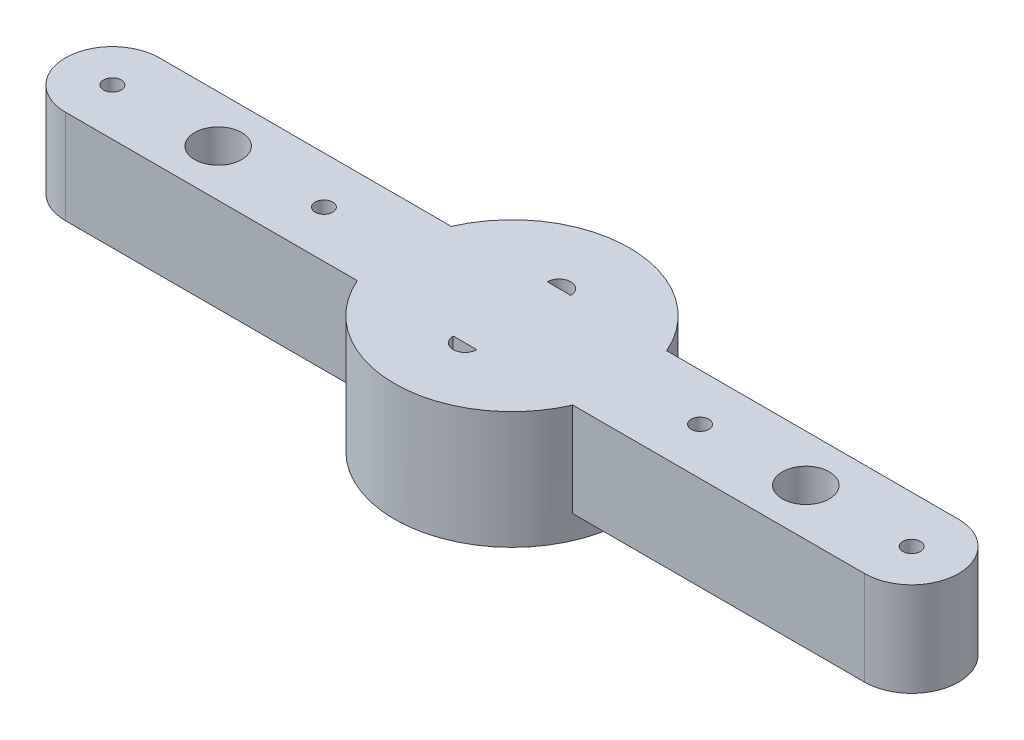
ISO-10303-21;
HEADER;
FILE_DESCRIPTION(('STEP AP214'),'2;1');
FILE_NAME('part.step','',(''),(''),'','','');
FILE_SCHEMA(('AUTOMOTIVE_DESIGN { 1 0 10303 214 1 1 1 1 }'));
ENDSEC;
DATA;
#1=APPLICATION_CONTEXT('core data for automotive mechanical design processes');
#2=APPLICATION_PROTOCOL_DEFINITION('international standard','automotive_design',2000,#1);
#3=PRODUCT_CONTEXT('',#1,'mechanical');
#4=PRODUCT('Part','Part','',(#3));
#5=PRODUCT_RELATED_PRODUCT_CATEGORY('part','',(#4));
#6=PRODUCT_DEFINITION_FORMATION('','',#4);
#7=PRODUCT_DEFINITION_CONTEXT('part definition',#1,'design');
#8=PRODUCT_DEFINITION('design','',#6,#7);
#9=PRODUCT_DEFINITION_SHAPE('','',#8);
#10=(LENGTH_UNIT() NAMED_UNIT(*) SI_UNIT(.MILLI.,.METRE.));
#11=(NAMED_UNIT(*) PLANE_ANGLE_UNIT() SI_UNIT($,.RADIAN.));
#12=(NAMED_UNIT(*) SI_UNIT($,.STERADIAN.) SOLID_ANGLE_UNIT());
#13=UNCERTAINTY_MEASURE_WITH_UNIT(LENGTH_MEASURE(1.E-05),#10,'distance_accuracy_value','');
#14=(GEOMETRIC_REPRESENTATION_CONTEXT(3) GLOBAL_UNCERTAINTY_ASSIGNED_CONTEXT((#13)) GLOBAL_UNIT_ASSIGNED_CONTEXT((#10,
#11,#12)) REPRESENTATION_CONTEXT('',''));
#15=CARTESIAN_POINT('',(0.,0.,0.));
#16=DIRECTION('',(0.,0.,1.));
#17=DIRECTION('',(1.,0.,0.));
#18=AXIS2_PLACEMENT_3D('',#15,#16,#17);
#19=CARTESIAN_POINT('',(34.,0.,0.));
#20=DIRECTION('',(0.,-1.,0.));
#21=DIRECTION('',(0.,0.,-1.));
#22=AXIS2_PLACEMENT_3D('',#19,#20,#21);
#23=PLANE('',#22);
#24=CARTESIAN_POINT('',(0.,0.,0.));
#25=DIRECTION('',(0.,-1.,0.));
#26=DIRECTION('',(0.,0.,-1.));
#27=AXIS2_PLACEMENT_3D('',#24,#25,#26);
#28=CIRCLE('',#27,10.);
#29=CARTESIAN_POINT('',(9.16515138991168,0.,-4.));
#30=VERTEX_POINT('',#29);
#31=CARTESIAN_POINT('',(9.16515138991168,0.,4.));
#32=VERTEX_POINT('',#31);
#33=EDGE_CURVE('E181',#30,#32,#28,.T.);
#34=ORIENTED_EDGE('',*,*,#33,.F.);
#35=DIRECTION('',(-1.,0.,0.));
#36=VECTOR('',#35,1.);
#37=CARTESIAN_POINT('',(-34.,0.,-4.));
#38=LINE('',#37,#36);
#39=CARTESIAN_POINT('',(34.,0.,-4.));
#40=VERTEX_POINT('',#39);
#41=EDGE_CURVE('E131',#40,#30,#38,.T.);
#42=ORIENTED_EDGE('',*,*,#41,.F.);
#43=CARTESIAN_POINT('',(34.,0.,0.));
#44=DIRECTION('',(0.,1.,0.));
#45=DIRECTION('',(0.,0.,-1.));
#46=AXIS2_PLACEMENT_3D('',#43,#44,#45);
#47=CIRCLE('',#46,4.);
#48=CARTESIAN_POINT('',(34.,0.,4.));
#49=VERTEX_POINT('',#48);
#50=EDGE_CURVE('E240',#49,#40,#47,.T.);
#51=ORIENTED_EDGE('',*,*,#50,.F.);
#52=DIRECTION('',(1.,0.,0.));
#53=VECTOR('',#52,1.);
#54=CARTESIAN_POINT('',(34.,0.,4.));
#55=LINE('',#54,#53);
#56=EDGE_CURVE('E220',#32,#49,#55,.T.);
#57=ORIENTED_EDGE('',*,*,#56,.F.);
#58=EDGE_LOOP('',(#34,#42,#51,#57));
#59=FACE_BOUND('',#58,.T.);
#60=CARTESIAN_POINT('',(16.,0.,0.));
#61=DIRECTION('',(0.,1.,0.));
#62=DIRECTION('',(0.,0.,1.));
#63=AXIS2_PLACEMENT_3D('',#60,#61,#62);
#64=CIRCLE('',#63,0.750000000000002);
#65=CARTESIAN_POINT('',(16.,0.,0.750000000000002));
#66=VERTEX_POINT('',#65);
#67=EDGE_CURVE('E186',#66,#66,#64,.T.);
#68=ORIENTED_EDGE('',*,*,#67,.T.);
#69=EDGE_LOOP('',(#68));
#70=FACE_BOUND('',#69,.T.);
#71=CARTESIAN_POINT('',(25.,0.,0.));
#72=DIRECTION('',(0.,1.,0.));
#73=DIRECTION('',(0.,0.,1.));
#74=AXIS2_PLACEMENT_3D('',#71,#72,#73);
#75=CIRCLE('',#74,2.);
#76=CARTESIAN_POINT('',(25.,0.,2.));
#77=VERTEX_POINT('',#76);
#78=EDGE_CURVE('E208',#77,#77,#75,.T.);
#79=ORIENTED_EDGE('',*,*,#78,.T.);
#80=EDGE_LOOP('',(#79));
#81=FACE_BOUND('',#80,.T.);
#82=CARTESIAN_POINT('',(34.,0.,0.));
#83=DIRECTION('',(0.,1.,0.));
#84=DIRECTION('',(0.,0.,1.));
#85=AXIS2_PLACEMENT_3D('',#82,#83,#84);
#86=CIRCLE('',#85,0.749999999999999);
#87=CARTESIAN_POINT('',(34.,0.,0.749999999999999));
#88=VERTEX_POINT('',#87);
#89=EDGE_CURVE('E202',#88,#88,#86,.T.);
#90=ORIENTED_EDGE('',*,*,#89,.T.);
#91=EDGE_LOOP('',(#90));
#92=FACE_BOUND('',#91,.T.);
#93=ADVANCED_FACE('F33',(#59,#70,#81,#92),#23,.T.);
#94=CARTESIAN_POINT('',(1.,0.,-4.));
#95=VERTEX_POINT('',#94);
#96=CARTESIAN_POINT('',(-1.,0.,-4.));
#97=VERTEX_POINT('',#96);
#98=EDGE_CURVE('E121',#95,#97,#38,.T.);
#99=ORIENTED_EDGE('',*,*,#98,.F.);
#100=CARTESIAN_POINT('',(0.,0.,-4.));
#101=DIRECTION('',(0.,-1.,0.));
#102=DIRECTION('',(0.,0.,-1.));
#103=AXIS2_PLACEMENT_3D('',#100,#101,#102);
#104=CIRCLE('',#103,1.);
#105=EDGE_CURVE('E134',#95,#97,#104,.T.);
#106=ORIENTED_EDGE('',*,*,#105,.T.);
#107=EDGE_LOOP('',(#99,#106));
#108=FACE_BOUND('',#107,.T.);
#109=ADVANCED_FACE('F135',(#108),#23,.T.);
#110=CARTESIAN_POINT('',(-1.,0.,4.));
#111=VERTEX_POINT('',#110);
#112=CARTESIAN_POINT('',(1.,0.,4.));
#113=VERTEX_POINT('',#112);
#114=EDGE_CURVE('E241',#111,#113,#55,.T.);
#115=ORIENTED_EDGE('',*,*,#114,.F.);
#116=CARTESIAN_POINT('',(0.,0.,4.));
#117=DIRECTION('',(0.,-1.,0.));
#118=DIRECTION('',(0.,0.,-1.));
#119=AXIS2_PLACEMENT_3D('',#116,#117,#118);
#120=CIRCLE('',#119,1.);
#121=EDGE_CURVE('E159',#111,#113,#120,.T.);
#122=ORIENTED_EDGE('',*,*,#121,.T.);
#123=EDGE_LOOP('',(#115,#122));
#124=FACE_BOUND('',#123,.T.);
#125=ADVANCED_FACE('F278',(#124),#23,.T.);
#126=CARTESIAN_POINT('',(34.,8.,4.));
#127=DIRECTION('',(0.,0.,-1.));
#128=DIRECTION('',(-1.,0.,0.));
#129=AXIS2_PLACEMENT_3D('',#126,#127,#128);
#130=PLANE('',#129);
#131=DIRECTION('',(0.,1.,0.));
#132=VECTOR('',#131,1.);
#133=CARTESIAN_POINT('',(-1.,-2.,4.));
#134=LINE('',#133,#132);
#135=CARTESIAN_POINT('',(-1.,8.,4.));
#136=VERTEX_POINT('',#135);
#137=EDGE_CURVE('E11',#111,#136,#134,.T.);
#138=ORIENTED_EDGE('',*,*,#137,.F.);
#139=ORIENTED_EDGE('',*,*,#114,.T.);
#140=DIRECTION('',(0.,1.,0.));
#141=VECTOR('',#140,1.);
#142=CARTESIAN_POINT('',(1.,-2.,4.));
#143=LINE('',#142,#141);
#144=CARTESIAN_POINT('',(1.,8.,4.));
#145=VERTEX_POINT('',#144);
#146=EDGE_CURVE('E41',#145,#113,#143,.F.);
#147=ORIENTED_EDGE('',*,*,#146,.F.);
#148=DIRECTION('',(1.,0.,0.));
#149=VECTOR('',#148,1.);
#150=CARTESIAN_POINT('',(-34.,8.,4.));
#151=LINE('',#150,#149);
#152=EDGE_CURVE('E227',#136,#145,#151,.T.);
#153=ORIENTED_EDGE('',*,*,#152,.F.);
#154=EDGE_LOOP('',(#138,#139,#147,#153));
#155=FACE_BOUND('',#154,.T.);
#156=ADVANCED_FACE('F276',(#155),#130,.F.);
#157=CARTESIAN_POINT('',(-34.,0.,4.));
#158=VERTEX_POINT('',#157);
#159=CARTESIAN_POINT('',(-9.16515138991168,0.,4.));
#160=VERTEX_POINT('',#159);
#161=EDGE_CURVE('E237',#158,#160,#55,.T.);
#162=ORIENTED_EDGE('',*,*,#161,.T.);
#163=DIRECTION('',(0.,1.,0.));
#164=VECTOR('',#163,1.);
#165=CARTESIAN_POINT('',(-9.16515138991168,-2.,4.));
#166=LINE('',#165,#164);
#167=CARTESIAN_POINT('',(-9.16515138991168,8.,4.));
#168=VERTEX_POINT('',#167);
#169=EDGE_CURVE('E180',#160,#168,#166,.T.);
#170=ORIENTED_EDGE('',*,*,#169,.T.);
#171=CARTESIAN_POINT('',(-34.,8.,4.));
#172=VERTEX_POINT('',#171);
#173=EDGE_CURVE('E223',#172,#168,#151,.T.);
#174=ORIENTED_EDGE('',*,*,#173,.F.);
#175=DIRECTION('',(0.,-1.,0.));
#176=VECTOR('',#175,1.);
#177=CARTESIAN_POINT('',(-34.,8.,4.));
#178=LINE('',#177,#176);
#179=EDGE_CURVE('E236',#172,#158,#178,.T.);
#180=ORIENTED_EDGE('',*,*,#179,.T.);
#181=EDGE_LOOP('',(#162,#170,#174,#180));
#182=FACE_BOUND('',#181,.T.);
#183=ADVANCED_FACE('F286',(#182),#130,.F.);
#184=CARTESIAN_POINT('',(-34.,8.,-4.));
#185=DIRECTION('',(0.,0.,1.));
#186=DIRECTION('',(1.,0.,0.));
#187=AXIS2_PLACEMENT_3D('',#184,#185,#186);
#188=PLANE('',#187);
#189=DIRECTION('',(0.,1.,0.));
#190=VECTOR('',#189,1.);
#191=CARTESIAN_POINT('',(1.,-2.,-4.));
#192=LINE('',#191,#190);
#193=CARTESIAN_POINT('',(1.,8.,-4.));
#194=VERTEX_POINT('',#193);
#195=EDGE_CURVE('E128',#95,#194,#192,.T.);
#196=ORIENTED_EDGE('',*,*,#195,.F.);
#197=ORIENTED_EDGE('',*,*,#98,.T.);
#198=DIRECTION('',(0.,1.,0.));
#199=VECTOR('',#198,1.);
#200=CARTESIAN_POINT('',(-1.,-2.,-4.));
#201=LINE('',#200,#199);
#202=CARTESIAN_POINT('',(-1.,8.,-4.));
#203=VERTEX_POINT('',#202);
#204=EDGE_CURVE('E125',#203,#97,#201,.F.);
#205=ORIENTED_EDGE('',*,*,#204,.F.);
#206=DIRECTION('',(-1.,0.,0.));
#207=VECTOR('',#206,1.);
#208=CARTESIAN_POINT('',(25.,8.,-4.));
#209=LINE('',#208,#207);
#210=EDGE_CURVE('E234',#194,#203,#209,.T.);
#211=ORIENTED_EDGE('',*,*,#210,.F.);
#212=EDGE_LOOP('',(#196,#197,#205,#211));
#213=FACE_BOUND('',#212,.T.);
#214=ADVANCED_FACE('F123',(#213),#188,.F.);
#215=ORIENTED_EDGE('',*,*,#41,.T.);
#216=DIRECTION('',(0.,1.,0.));
#217=VECTOR('',#216,1.);
#218=CARTESIAN_POINT('',(9.16515138991168,-2.,-4.));
#219=LINE('',#218,#217);
#220=CARTESIAN_POINT('',(9.16515138991168,8.,-4.));
#221=VERTEX_POINT('',#220);
#222=EDGE_CURVE('E154',#30,#221,#219,.T.);
#223=ORIENTED_EDGE('',*,*,#222,.T.);
#224=CARTESIAN_POINT('',(34.,8.,-4.));
#225=VERTEX_POINT('',#224);
#226=EDGE_CURVE('E230',#225,#221,#209,.T.);
#227=ORIENTED_EDGE('',*,*,#226,.F.);
#228=DIRECTION('',(0.,-1.,0.));
#229=VECTOR('',#228,1.);
#230=CARTESIAN_POINT('',(34.,8.,-4.));
#231=LINE('',#230,#229);
#232=EDGE_CURVE('E149',#225,#40,#231,.T.);
#233=ORIENTED_EDGE('',*,*,#232,.T.);
#234=EDGE_LOOP('',(#215,#223,#227,#233));
#235=FACE_BOUND('',#234,.T.);
#236=ADVANCED_FACE('F256',(#235),#188,.F.);
#237=CARTESIAN_POINT('',(34.,8.,0.));
#238=DIRECTION('',(0.,-1.,0.));
#239=DIRECTION('',(0.,0.,-1.));
#240=AXIS2_PLACEMENT_3D('',#237,#238,#239);
#241=PLANE('',#240);
#242=CARTESIAN_POINT('',(-16.,8.,0.));
#243=DIRECTION('',(0.,1.,0.));
#244=DIRECTION('',(0.,0.,1.));
#245=AXIS2_PLACEMENT_3D('',#242,#243,#244);
#246=CIRCLE('',#245,0.75);
#247=CARTESIAN_POINT('',(-16.,8.,0.75));
#248=VERTEX_POINT('',#247);
#249=EDGE_CURVE('E193',#248,#248,#246,.T.);
#250=ORIENTED_EDGE('',*,*,#249,.F.);
#251=EDGE_LOOP('',(#250));
#252=FACE_BOUND('',#251,.T.);
#253=CARTESIAN_POINT('',(-25.,8.,0.));
#254=DIRECTION('',(0.,1.,0.));
#255=DIRECTION('',(0.,0.,1.));
#256=AXIS2_PLACEMENT_3D('',#253,#254,#255);
#257=CIRCLE('',#256,2.);
#258=CARTESIAN_POINT('',(-25.,8.,2.));
#259=VERTEX_POINT('',#258);
#260=EDGE_CURVE('E217',#259,#259,#257,.T.);
#261=ORIENTED_EDGE('',*,*,#260,.F.);
#262=EDGE_LOOP('',(#261));
#263=FACE_BOUND('',#262,.T.);
#264=ORIENTED_EDGE('',*,*,#173,.T.);
#265=CARTESIAN_POINT('',(0.,8.,0.));
#266=DIRECTION('',(0.,1.,0.));
#267=DIRECTION('',(0.,0.,1.));
#268=AXIS2_PLACEMENT_3D('',#265,#266,#267);
#269=CIRCLE('',#268,10.);
#270=CARTESIAN_POINT('',(9.16515138991168,8.,4.));
#271=VERTEX_POINT('',#270);
#272=EDGE_CURVE('E171',#168,#271,#269,.T.);
#273=ORIENTED_EDGE('',*,*,#272,.T.);
#274=CARTESIAN_POINT('',(34.,8.,4.));
#275=VERTEX_POINT('',#274);
#276=EDGE_CURVE('E48',#271,#275,#151,.T.);
#277=ORIENTED_EDGE('',*,*,#276,.T.);
#278=CARTESIAN_POINT('',(34.,8.,0.));
#279=DIRECTION('',(0.,1.,0.));
#280=DIRECTION('',(0.,0.,-1.));
#281=AXIS2_PLACEMENT_3D('',#278,#279,#280);
#282=CIRCLE('',#281,4.);
#283=EDGE_CURVE('E226',#275,#225,#282,.T.);
#284=ORIENTED_EDGE('',*,*,#283,.T.);
#285=ORIENTED_EDGE('',*,*,#226,.T.);
#286=CARTESIAN_POINT('',(-9.16515138991168,8.,-4.));
#287=VERTEX_POINT('',#286);
#288=EDGE_CURVE('E175',#221,#287,#269,.T.);
#289=ORIENTED_EDGE('',*,*,#288,.T.);
#290=CARTESIAN_POINT('',(-34.,8.,-4.));
#291=VERTEX_POINT('',#290);
#292=EDGE_CURVE('E229',#287,#291,#209,.T.);
#293=ORIENTED_EDGE('',*,*,#292,.T.);
#294=CARTESIAN_POINT('',(-34.,8.,0.));
#295=DIRECTION('',(0.,1.,0.));
#296=DIRECTION('',(0.,0.,1.));
#297=AXIS2_PLACEMENT_3D('',#294,#295,#296);
#298=CIRCLE('',#297,4.);
#299=EDGE_CURVE('E233',#291,#172,#298,.T.);
#300=ORIENTED_EDGE('',*,*,#299,.T.);
#301=EDGE_LOOP('',(#264,#273,#277,#284,#285,#289,#293,#300));
#302=FACE_BOUND('',#301,.T.);
#303=CARTESIAN_POINT('',(-34.,8.,0.));
#304=DIRECTION('',(0.,1.,0.));
#305=DIRECTION('',(0.,0.,1.));
#306=AXIS2_PLACEMENT_3D('',#303,#304,#305);
#307=CIRCLE('',#306,0.749999999999999);
#308=CARTESIAN_POINT('',(-34.,8.,0.749999999999999));
#309=VERTEX_POINT('',#308);
#310=EDGE_CURVE('E199',#309,#309,#307,.T.);
#311=ORIENTED_EDGE('',*,*,#310,.F.);
#312=EDGE_LOOP('',(#311));
#313=FACE_BOUND('',#312,.T.);
#314=ORIENTED_EDGE('',*,*,#152,.T.);
#315=CARTESIAN_POINT('',(0.,8.,4.));
#316=DIRECTION('',(0.,1.,0.));
#317=DIRECTION('',(0.,0.,1.));
#318=AXIS2_PLACEMENT_3D('',#315,#316,#317);
#319=CIRCLE('',#318,1.);
#320=EDGE_CURVE('E161',#136,#145,#319,.T.);
#321=ORIENTED_EDGE('',*,*,#320,.F.);
#322=EDGE_LOOP('',(#314,#321));
#323=FACE_BOUND('',#322,.T.);
#324=CARTESIAN_POINT('',(0.,8.,-4.));
#325=DIRECTION('',(0.,1.,0.));
#326=DIRECTION('',(0.,0.,1.));
#327=AXIS2_PLACEMENT_3D('',#324,#325,#326);
#328=CIRCLE('',#327,1.);
#329=EDGE_CURVE('E143',#194,#203,#328,.T.);
#330=ORIENTED_EDGE('',*,*,#329,.F.);
#331=ORIENTED_EDGE('',*,*,#210,.T.);
#332=EDGE_LOOP('',(#330,#331));
#333=FACE_BOUND('',#332,.T.);
#334=CARTESIAN_POINT('',(16.,8.,0.));
#335=DIRECTION('',(0.,1.,0.));
#336=DIRECTION('',(0.,0.,1.));
#337=AXIS2_PLACEMENT_3D('',#334,#335,#336);
#338=CIRCLE('',#337,0.750000000000002);
#339=CARTESIAN_POINT('',(16.,8.,0.750000000000002));
#340=VERTEX_POINT('',#339);
#341=EDGE_CURVE('E187',#340,#340,#338,.T.);
#342=ORIENTED_EDGE('',*,*,#341,.F.);
#343=EDGE_LOOP('',(#342));
#344=FACE_BOUND('',#343,.T.);
#345=CARTESIAN_POINT('',(25.,8.,0.));
#346=DIRECTION('',(0.,1.,0.));
#347=DIRECTION('',(0.,0.,1.));
#348=AXIS2_PLACEMENT_3D('',#345,#346,#347);
#349=CIRCLE('',#348,2.);
#350=CARTESIAN_POINT('',(25.,8.,2.));
#351=VERTEX_POINT('',#350);
#352=EDGE_CURVE('E211',#351,#351,#349,.T.);
#353=ORIENTED_EDGE('',*,*,#352,.F.);
#354=EDGE_LOOP('',(#353));
#355=FACE_BOUND('',#354,.T.);
#356=CARTESIAN_POINT('',(34.,8.,0.));
#357=DIRECTION('',(0.,1.,0.));
#358=DIRECTION('',(0.,0.,1.));
#359=AXIS2_PLACEMENT_3D('',#356,#357,#358);
#360=CIRCLE('',#359,0.749999999999999);
#361=CARTESIAN_POINT('',(34.,8.,0.749999999999999));
#362=VERTEX_POINT('',#361);
#363=EDGE_CURVE('E205',#362,#362,#360,.T.);
#364=ORIENTED_EDGE('',*,*,#363,.F.);
#365=EDGE_LOOP('',(#364));
#366=FACE_BOUND('',#365,.T.);
#367=ADVANCED_FACE('F273',(#252,#263,#302,#313,#323,#333,#344,#355,#366),#241,.F.);
#368=CARTESIAN_POINT('',(-9.16515138991168,0.,-4.));
#369=VERTEX_POINT('',#368);
#370=EDGE_CURVE('E137',#160,#369,#28,.T.);
#371=ORIENTED_EDGE('',*,*,#370,.F.);
#372=ORIENTED_EDGE('',*,*,#161,.F.);
#373=CARTESIAN_POINT('',(-34.,0.,0.));
#374=DIRECTION('',(0.,1.,0.));
#375=DIRECTION('',(0.,0.,1.));
#376=AXIS2_PLACEMENT_3D('',#373,#374,#375);
#377=CIRCLE('',#376,4.);
#378=CARTESIAN_POINT('',(-34.,0.,-4.));
#379=VERTEX_POINT('',#378);
#380=EDGE_CURVE('E245',#379,#158,#377,.T.);
#381=ORIENTED_EDGE('',*,*,#380,.F.);
#382=EDGE_CURVE('E132',#369,#379,#38,.T.);
#383=ORIENTED_EDGE('',*,*,#382,.F.);
#384=EDGE_LOOP('',(#371,#372,#381,#383));
#385=FACE_BOUND('',#384,.T.);
#386=CARTESIAN_POINT('',(-16.,0.,0.));
#387=DIRECTION('',(0.,1.,0.));
#388=DIRECTION('',(0.,0.,1.));
#389=AXIS2_PLACEMENT_3D('',#386,#387,#388);
#390=CIRCLE('',#389,0.75);
#391=CARTESIAN_POINT('',(-16.,0.,0.75));
#392=VERTEX_POINT('',#391);
#393=EDGE_CURVE('E190',#392,#392,#390,.T.);
#394=ORIENTED_EDGE('',*,*,#393,.T.);
#395=EDGE_LOOP('',(#394));
#396=FACE_BOUND('',#395,.T.);
#397=CARTESIAN_POINT('',(-25.,0.,0.));
#398=DIRECTION('',(0.,1.,0.));
#399=DIRECTION('',(0.,0.,1.));
#400=AXIS2_PLACEMENT_3D('',#397,#398,#399);
#401=CIRCLE('',#400,2.);
#402=CARTESIAN_POINT('',(-25.,0.,2.));
#403=VERTEX_POINT('',#402);
#404=EDGE_CURVE('E214',#403,#403,#401,.T.);
#405=ORIENTED_EDGE('',*,*,#404,.T.);
#406=EDGE_LOOP('',(#405));
#407=FACE_BOUND('',#406,.T.);
#408=CARTESIAN_POINT('',(-34.,0.,0.));
#409=DIRECTION('',(0.,1.,0.));
#410=DIRECTION('',(0.,0.,1.));
#411=AXIS2_PLACEMENT_3D('',#408,#409,#410);
#412=CIRCLE('',#411,0.749999999999999);
#413=CARTESIAN_POINT('',(-34.,0.,0.749999999999999));
#414=VERTEX_POINT('',#413);
#415=EDGE_CURVE('E196',#414,#414,#412,.T.);
#416=ORIENTED_EDGE('',*,*,#415,.T.);
#417=EDGE_LOOP('',(#416));
#418=FACE_BOUND('',#417,.T.);
#419=ADVANCED_FACE('F281',(#385,#396,#407,#418),#23,.T.);
#420=ORIENTED_EDGE('',*,*,#276,.F.);
#421=DIRECTION('',(0.,1.,0.));
#422=VECTOR('',#421,1.);
#423=CARTESIAN_POINT('',(9.16515138991168,-2.,4.));
#424=LINE('',#423,#422);
#425=EDGE_CURVE('E183',#271,#32,#424,.F.);
#426=ORIENTED_EDGE('',*,*,#425,.T.);
#427=ORIENTED_EDGE('',*,*,#56,.T.);
#428=DIRECTION('',(0.,-1.,0.));
#429=VECTOR('',#428,1.);
#430=CARTESIAN_POINT('',(34.,8.,4.));
#431=LINE('',#430,#429);
#432=EDGE_CURVE('E144',#275,#49,#431,.T.);
#433=ORIENTED_EDGE('',*,*,#432,.F.);
#434=EDGE_LOOP('',(#420,#426,#427,#433));
#435=FACE_BOUND('',#434,.T.);
#436=ADVANCED_FACE('F35',(#435),#130,.F.);
#437=CARTESIAN_POINT('',(34.,8.,0.));
#438=DIRECTION('',(0.,-1.,0.));
#439=DIRECTION('',(0.,0.,-1.));
#440=AXIS2_PLACEMENT_3D('',#437,#438,#439);
#441=CYLINDRICAL_SURFACE('',#440,4.);
#442=ORIENTED_EDGE('',*,*,#50,.T.);
#443=ORIENTED_EDGE('',*,*,#232,.F.);
#444=ORIENTED_EDGE('',*,*,#283,.F.);
#445=ORIENTED_EDGE('',*,*,#432,.T.);
#446=EDGE_LOOP('',(#442,#443,#444,#445));
#447=FACE_BOUND('',#446,.T.);
#448=ADVANCED_FACE('F260',(#447),#441,.T.);
#449=ORIENTED_EDGE('',*,*,#292,.F.);
#450=DIRECTION('',(0.,1.,0.));
#451=VECTOR('',#450,1.);
#452=CARTESIAN_POINT('',(-9.16515138991168,-2.,-4.));
#453=LINE('',#452,#451);
#454=EDGE_CURVE('E146',#287,#369,#453,.F.);
#455=ORIENTED_EDGE('',*,*,#454,.T.);
#456=ORIENTED_EDGE('',*,*,#382,.T.);
#457=DIRECTION('',(0.,-1.,0.));
#458=VECTOR('',#457,1.);
#459=CARTESIAN_POINT('',(-34.,8.,-4.));
#460=LINE('',#459,#458);
#461=EDGE_CURVE('E250',#291,#379,#460,.T.);
#462=ORIENTED_EDGE('',*,*,#461,.F.);
#463=EDGE_LOOP('',(#449,#455,#456,#462));
#464=FACE_BOUND('',#463,.T.);
#465=ADVANCED_FACE('F338',(#464),#188,.F.);
#466=CARTESIAN_POINT('',(-34.,8.,0.));
#467=DIRECTION('',(0.,-1.,0.));
#468=DIRECTION('',(0.,0.,-1.));
#469=AXIS2_PLACEMENT_3D('',#466,#467,#468);
#470=CYLINDRICAL_SURFACE('',#469,4.);
#471=ORIENTED_EDGE('',*,*,#380,.T.);
#472=ORIENTED_EDGE('',*,*,#179,.F.);
#473=ORIENTED_EDGE('',*,*,#299,.F.);
#474=ORIENTED_EDGE('',*,*,#461,.T.);
#475=EDGE_LOOP('',(#471,#472,#473,#474));
#476=FACE_BOUND('',#475,.T.);
#477=ADVANCED_FACE('F388',(#476),#470,.T.);
#478=CARTESIAN_POINT('',(-25.,8.,0.));
#479=DIRECTION('',(0.,-1.,0.));
#480=DIRECTION('',(0.,0.,-1.));
#481=AXIS2_PLACEMENT_3D('',#478,#479,#480);
#482=CYLINDRICAL_SURFACE('',#481,2.);
#483=ORIENTED_EDGE('',*,*,#260,.T.);
#484=EDGE_LOOP('',(#483));
#485=FACE_BOUND('',#484,.T.);
#486=ORIENTED_EDGE('',*,*,#404,.F.);
#487=EDGE_LOOP('',(#486));
#488=FACE_BOUND('',#487,.T.);
#489=ADVANCED_FACE('F380',(#485,#488),#482,.F.);
#490=CARTESIAN_POINT('',(25.,8.,0.));
#491=DIRECTION('',(0.,-1.,0.));
#492=DIRECTION('',(0.,0.,-1.));
#493=AXIS2_PLACEMENT_3D('',#490,#491,#492);
#494=CYLINDRICAL_SURFACE('',#493,2.);
#495=ORIENTED_EDGE('',*,*,#352,.T.);
#496=EDGE_LOOP('',(#495));
#497=FACE_BOUND('',#496,.T.);
#498=ORIENTED_EDGE('',*,*,#78,.F.);
#499=EDGE_LOOP('',(#498));
#500=FACE_BOUND('',#499,.T.);
#501=ADVANCED_FACE('F372',(#497,#500),#494,.F.);
#502=CARTESIAN_POINT('',(34.,8.,0.));
#503=DIRECTION('',(0.,-1.,0.));
#504=DIRECTION('',(0.,0.,-1.));
#505=AXIS2_PLACEMENT_3D('',#502,#503,#504);
#506=CYLINDRICAL_SURFACE('',#505,0.749999999999999);
#507=ORIENTED_EDGE('',*,*,#363,.T.);
#508=EDGE_LOOP('',(#507));
#509=FACE_BOUND('',#508,.T.);
#510=ORIENTED_EDGE('',*,*,#89,.F.);
#511=EDGE_LOOP('',(#510));
#512=FACE_BOUND('',#511,.T.);
#513=ADVANCED_FACE('F364',(#509,#512),#506,.F.);
#514=CARTESIAN_POINT('',(-34.,8.,0.));
#515=DIRECTION('',(0.,-1.,0.));
#516=DIRECTION('',(0.,0.,-1.));
#517=AXIS2_PLACEMENT_3D('',#514,#515,#516);
#518=CYLINDRICAL_SURFACE('',#517,0.749999999999999);
#519=ORIENTED_EDGE('',*,*,#310,.T.);
#520=EDGE_LOOP('',(#519));
#521=FACE_BOUND('',#520,.T.);
#522=ORIENTED_EDGE('',*,*,#415,.F.);
#523=EDGE_LOOP('',(#522));
#524=FACE_BOUND('',#523,.T.);
#525=ADVANCED_FACE('F356',(#521,#524),#518,.F.);
#526=CARTESIAN_POINT('',(-16.,8.,0.));
#527=DIRECTION('',(0.,-1.,0.));
#528=DIRECTION('',(0.,0.,-1.));
#529=AXIS2_PLACEMENT_3D('',#526,#527,#528);
#530=CYLINDRICAL_SURFACE('',#529,0.75);
#531=ORIENTED_EDGE('',*,*,#249,.T.);
#532=EDGE_LOOP('',(#531));
#533=FACE_BOUND('',#532,.T.);
#534=ORIENTED_EDGE('',*,*,#393,.F.);
#535=EDGE_LOOP('',(#534));
#536=FACE_BOUND('',#535,.T.);
#537=ADVANCED_FACE('F351',(#533,#536),#530,.F.);
#538=CARTESIAN_POINT('',(16.,8.,0.));
#539=DIRECTION('',(0.,-1.,0.));
#540=DIRECTION('',(0.,0.,-1.));
#541=AXIS2_PLACEMENT_3D('',#538,#539,#540);
#542=CYLINDRICAL_SURFACE('',#541,0.750000000000002);
#543=ORIENTED_EDGE('',*,*,#341,.T.);
#544=EDGE_LOOP('',(#543));
#545=FACE_BOUND('',#544,.T.);
#546=ORIENTED_EDGE('',*,*,#67,.F.);
#547=EDGE_LOOP('',(#546));
#548=FACE_BOUND('',#547,.T.);
#549=ADVANCED_FACE('F300',(#545,#548),#542,.F.);
#550=CARTESIAN_POINT('',(0.,-2.,4.));
#551=DIRECTION('',(0.,1.,0.));
#552=DIRECTION('',(0.,0.,1.));
#553=AXIS2_PLACEMENT_3D('',#550,#551,#552);
#554=CYLINDRICAL_SURFACE('',#553,1.);
#555=CARTESIAN_POINT('',(0.,-2.,4.));
#556=DIRECTION('',(0.,1.,0.));
#557=DIRECTION('',(0.,0.,1.));
#558=AXIS2_PLACEMENT_3D('',#555,#556,#557);
#559=CIRCLE('',#558,1.);
#560=CARTESIAN_POINT('',(0.,-2.,5.));
#561=VERTEX_POINT('',#560);
#562=EDGE_CURVE('E163',#561,#561,#559,.T.);
#563=ORIENTED_EDGE('',*,*,#562,.F.);
#564=EDGE_LOOP('',(#563));
#565=FACE_BOUND('',#564,.T.);
#566=ORIENTED_EDGE('',*,*,#121,.F.);
#567=ORIENTED_EDGE('',*,*,#137,.T.);
#568=ORIENTED_EDGE('',*,*,#320,.T.);
#569=ORIENTED_EDGE('',*,*,#146,.T.);
#570=EDGE_LOOP('',(#566,#567,#568,#569));
#571=FACE_BOUND('',#570,.T.);
#572=ADVANCED_FACE('F158',(#565,#571),#554,.F.);
#573=CARTESIAN_POINT('',(0.,-2.,0.));
#574=DIRECTION('',(0.,1.,0.));
#575=DIRECTION('',(0.,0.,1.));
#576=AXIS2_PLACEMENT_3D('',#573,#574,#575);
#577=CYLINDRICAL_SURFACE('',#576,10.);
#578=CARTESIAN_POINT('',(0.,-2.,0.));
#579=DIRECTION('',(0.,1.,0.));
#580=DIRECTION('',(0.,0.,1.));
#581=AXIS2_PLACEMENT_3D('',#578,#579,#580);
#582=CIRCLE('',#581,10.);
#583=CARTESIAN_POINT('',(0.,-2.,10.));
#584=VERTEX_POINT('',#583);
#585=EDGE_CURVE('E138',#584,#584,#582,.T.);
#586=ORIENTED_EDGE('',*,*,#585,.T.);
#587=EDGE_LOOP('',(#586));
#588=FACE_BOUND('',#587,.T.);
#589=ORIENTED_EDGE('',*,*,#425,.F.);
#590=ORIENTED_EDGE('',*,*,#272,.F.);
#591=ORIENTED_EDGE('',*,*,#169,.F.);
#592=ORIENTED_EDGE('',*,*,#370,.T.);
#593=ORIENTED_EDGE('',*,*,#454,.F.);
#594=ORIENTED_EDGE('',*,*,#288,.F.);
#595=ORIENTED_EDGE('',*,*,#222,.F.);
#596=ORIENTED_EDGE('',*,*,#33,.T.);
#597=EDGE_LOOP('',(#589,#590,#591,#592,#593,#594,#595,#596));
#598=FACE_BOUND('',#597,.T.);
#599=ADVANCED_FACE('F267',(#588,#598),#577,.T.);
#600=CARTESIAN_POINT('',(0.,-2.,-4.));
#601=DIRECTION('',(0.,1.,0.));
#602=DIRECTION('',(0.,0.,1.));
#603=AXIS2_PLACEMENT_3D('',#600,#601,#602);
#604=CYLINDRICAL_SURFACE('',#603,1.);
#605=CARTESIAN_POINT('',(0.,-2.,-4.));
#606=DIRECTION('',(0.,1.,0.));
#607=DIRECTION('',(0.,0.,1.));
#608=AXIS2_PLACEMENT_3D('',#605,#606,#607);
#609=CIRCLE('',#608,1.);
#610=CARTESIAN_POINT('',(0.,-2.,-3.));
#611=VERTEX_POINT('',#610);
#612=EDGE_CURVE('E168',#611,#611,#609,.T.);
#613=ORIENTED_EDGE('',*,*,#612,.F.);
#614=EDGE_LOOP('',(#613));
#615=FACE_BOUND('',#614,.T.);
#616=ORIENTED_EDGE('',*,*,#105,.F.);
#617=ORIENTED_EDGE('',*,*,#195,.T.);
#618=ORIENTED_EDGE('',*,*,#329,.T.);
#619=ORIENTED_EDGE('',*,*,#204,.T.);
#620=EDGE_LOOP('',(#616,#617,#618,#619));
#621=FACE_BOUND('',#620,.T.);
#622=ADVANCED_FACE('F141',(#615,#621),#604,.F.);
#623=CARTESIAN_POINT('',(0.,-2.,0.));
#624=DIRECTION('',(0.,1.,0.));
#625=DIRECTION('',(0.,0.,1.));
#626=AXIS2_PLACEMENT_3D('',#623,#624,#625);
#627=PLANE('',#626);
#628=ORIENTED_EDGE('',*,*,#562,.T.);
#629=EDGE_LOOP('',(#628));
#630=FACE_BOUND('',#629,.T.);
#631=ORIENTED_EDGE('',*,*,#612,.T.);
#632=EDGE_LOOP('',(#631));
#633=FACE_BOUND('',#632,.T.);
#634=ORIENTED_EDGE('',*,*,#585,.F.);
#635=EDGE_LOOP('',(#634));
#636=FACE_BOUND('',#635,.T.);
#637=ADVANCED_FACE('F465',(#630,#633,#636),#627,.F.);
#638=CLOSED_SHELL('',(#93,#109,#125,#156,#183,#214,#236,#367,#419,#436,#448,#465,#477,#489,#501,
#513,#525,#537,#549,#572,#599,#622,#637));
#639=MANIFOLD_SOLID_BREP('B2',#638);
#640=ADVANCED_BREP_SHAPE_REPRESENTATION('',(#18,#639),#14);
#641=SHAPE_DEFINITION_REPRESENTATION(#9,#640);
ENDSEC;
END-ISO-10303-21;
